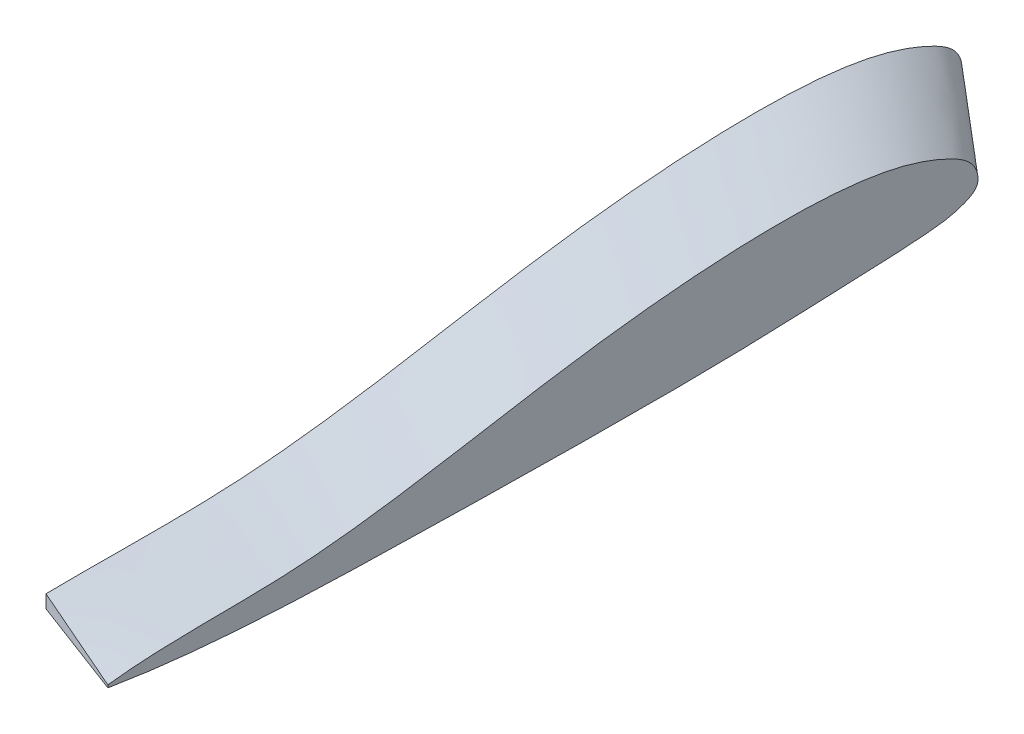
ISO-10303-21;
HEADER;
FILE_DESCRIPTION(('STEP AP214'),'2;1');
FILE_NAME('part.step','',(''),(''),'','','');
FILE_SCHEMA(('AUTOMOTIVE_DESIGN { 1 0 10303 214 1 1 1 1 }'));
ENDSEC;
DATA;
#1=APPLICATION_CONTEXT('core data for automotive mechanical design processes');
#2=APPLICATION_PROTOCOL_DEFINITION('international standard','automotive_design',2000,#1);
#3=PRODUCT_CONTEXT('',#1,'mechanical');
#4=PRODUCT('Part','Part','',(#3));
#5=PRODUCT_RELATED_PRODUCT_CATEGORY('part','',(#4));
#6=PRODUCT_DEFINITION_FORMATION('','',#4);
#7=PRODUCT_DEFINITION_CONTEXT('part definition',#1,'design');
#8=PRODUCT_DEFINITION('design','',#6,#7);
#9=PRODUCT_DEFINITION_SHAPE('','',#8);
#10=(LENGTH_UNIT() NAMED_UNIT(*) SI_UNIT(.MILLI.,.METRE.));
#11=(NAMED_UNIT(*) PLANE_ANGLE_UNIT() SI_UNIT($,.RADIAN.));
#12=(NAMED_UNIT(*) SI_UNIT($,.STERADIAN.) SOLID_ANGLE_UNIT());
#13=UNCERTAINTY_MEASURE_WITH_UNIT(LENGTH_MEASURE(1.E-05),#10,'distance_accuracy_value','');
#14=(GEOMETRIC_REPRESENTATION_CONTEXT(3) GLOBAL_UNCERTAINTY_ASSIGNED_CONTEXT((#13)) GLOBAL_UNIT_ASSIGNED_CONTEXT((#10,
#11,#12)) REPRESENTATION_CONTEXT('',''));
#15=CARTESIAN_POINT('',(0.,0.,0.));
#16=DIRECTION('',(0.,0.,1.));
#17=DIRECTION('',(1.,0.,0.));
#18=AXIS2_PLACEMENT_3D('',#15,#16,#17);
#19=CARTESIAN_POINT('',(170.,4.22486309630593,-316.029681338377));
#20=DIRECTION('',(1.,0.,0.));
#21=DIRECTION('',(0.,0.,-1.));
#22=AXIS2_PLACEMENT_3D('',#19,#20,#21);
#23=PLANE('',#22);
#24=DIRECTION('',(0.,-1.,0.));
#25=VECTOR('',#24,1.);
#26=CARTESIAN_POINT('',(170.,0.,16.3361038268365));
#27=LINE('',#26,#25);
#28=CARTESIAN_POINT('',(170.,0.,16.3361038268365));
#29=VERTEX_POINT('',#28);
#30=CARTESIAN_POINT('',(170.,-0.499999999999999,16.3361038268365));
#31=VERTEX_POINT('',#30);
#32=EDGE_CURVE('E177',#29,#31,#27,.T.);
#33=ORIENTED_EDGE('',*,*,#32,.T.);
#34=CARTESIAN_POINT('',(170.,-0.499999999999999,16.3361038268365));
#35=CARTESIAN_POINT('',(170.,-6.84562442936849,-21.8114676113761));
#36=CARTESIAN_POINT('',(170.,-8.68216132160674,-89.764065602392));
#37=CARTESIAN_POINT('',(170.,-10.1357344512242,-169.980320971194));
#38=CARTESIAN_POINT('',(170.,-9.90480118321219,-225.808636095163));
#39=CARTESIAN_POINT('',(170.,-8.2642986136554,-262.759582746442));
#40=CARTESIAN_POINT('',(170.,-7.22314333972637,-292.426285695098));
#41=CARTESIAN_POINT('',(170.,-5.26921371164876,-308.921424505229));
#42=CARTESIAN_POINT('',(170.,-1.05150908344166,-316.761099289889));
#43=CARTESIAN_POINT('',(170.,8.13638953658617,-316.064783193113));
#44=CARTESIAN_POINT('',(170.,17.9007463393962,-299.115019916297));
#45=CARTESIAN_POINT('',(170.,24.3524605176547,-272.102133361616));
#46=CARTESIAN_POINT('',(170.,25.9306596259218,-217.975981001916));
#47=CARTESIAN_POINT('',(170.,19.2473181685789,-163.129549014309));
#48=CARTESIAN_POINT('',(170.,8.46868752320201,-102.923022989016));
#49=CARTESIAN_POINT('',(170.,0.75449292878266,-48.6946557715225));
#50=CARTESIAN_POINT('',(170.,3.34373370943451,-6.76821708426023));
#51=CARTESIAN_POINT('',(170.,0.5,16.3361038268365));
#52=B_SPLINE_CURVE_WITH_KNOTS('',3,(#34,#35,#36,#37,#38,#39,#40,#41,#42,#43,#44,#45,#46,#47,#48,
#49,#50,#51),.UNSPECIFIED.,.F.,.F.,(4,1,1,1,1,1,1,1,1,1,1,1,1,1,1,4),(0.,0.170754034375658,
0.300594015973302,0.355532481277325,0.417679052325849,0.465123715916775,0.485110270012388,
0.493755431545612,0.499302038772995,0.52179404874064,0.57017493856222,0.626298387408252,
0.758208846476329,0.815081544629808,0.897203908804068,1.),.UNSPECIFIED.);
#53=CARTESIAN_POINT('',(170.,0.5,16.3361038268365));
#54=VERTEX_POINT('',#53);
#55=EDGE_CURVE('E51',#31,#54,#52,.T.);
#56=ORIENTED_EDGE('',*,*,#55,.T.);
#57=DIRECTION('',(0.,-1.,0.));
#58=VECTOR('',#57,1.);
#59=CARTESIAN_POINT('',(170.,0.5,16.3361038268365));
#60=LINE('',#59,#58);
#61=EDGE_CURVE('E11',#54,#29,#60,.T.);
#62=ORIENTED_EDGE('',*,*,#61,.T.);
#63=EDGE_LOOP('',(#33,#56,#62));
#64=FACE_BOUND('',#63,.T.);
#65=ADVANCED_FACE('F41',(#64),#23,.T.);
#66=CARTESIAN_POINT('',(130.,4.50921821265985,-349.839069787723));
#67=DIRECTION('',(1.,0.,0.));
#68=DIRECTION('',(0.,0.,-1.));
#69=AXIS2_PLACEMENT_3D('',#66,#67,#68);
#70=PLANE('',#69);
#71=DIRECTION('',(0.,-1.,0.));
#72=VECTOR('',#71,1.);
#73=CARTESIAN_POINT('',(130.,0.,0.));
#74=LINE('',#73,#72);
#75=CARTESIAN_POINT('',(130.,0.,0.));
#76=VERTEX_POINT('',#75);
#77=CARTESIAN_POINT('',(130.,-2.5,0.));
#78=VERTEX_POINT('',#77);
#79=EDGE_CURVE('E84',#76,#78,#74,.T.);
#80=ORIENTED_EDGE('',*,*,#79,.F.);
#81=DIRECTION('',(0.,-1.,0.));
#82=VECTOR('',#81,1.);
#83=CARTESIAN_POINT('',(130.,0.,0.));
#84=LINE('',#83,#82);
#85=CARTESIAN_POINT('',(130.,2.5,0.));
#86=VERTEX_POINT('',#85);
#87=EDGE_CURVE('E79',#86,#76,#84,.T.);
#88=ORIENTED_EDGE('',*,*,#87,.F.);
#89=CARTESIAN_POINT('',(130.,-2.5,0.));
#90=CARTESIAN_POINT('',(130.,-6.52683155487076,-40.3436066692087));
#91=CARTESIAN_POINT('',(130.,-9.38733182249202,-111.722835657678));
#92=CARTESIAN_POINT('',(130.,-10.6469838114329,-196.124650234008));
#93=CARTESIAN_POINT('',(130.,-10.4304964788481,-254.888785279017));
#94=CARTESIAN_POINT('',(130.,-8.69831278964423,-293.785022846869));
#95=CARTESIAN_POINT('',(130.,-7.60339821007806,-325.013033186047));
#96=CARTESIAN_POINT('',(130.,-5.54653455345342,-342.376346163001));
#97=CARTESIAN_POINT('',(130.,-1.10685261086616,-350.628634815587));
#98=CARTESIAN_POINT('',(130.,8.56462304257141,-349.89567054793));
#99=CARTESIAN_POINT('',(130.,18.8428380093671,-332.053815956821));
#100=CARTESIAN_POINT('',(130.,25.6346311989739,-303.619183469784));
#101=CARTESIAN_POINT('',(130.,27.292304907744,-246.64439175931));
#102=CARTESIAN_POINT('',(130.,20.2823791611908,-188.910565094306));
#103=CARTESIAN_POINT('',(130.,8.87683626299398,-125.537028123098));
#104=CARTESIAN_POINT('',(130.,1.03871569544147,-68.4655600583932));
#105=CARTESIAN_POINT('',(130.,2.86846913775832,-24.378325415327));
#106=CARTESIAN_POINT('',(130.,2.5,0.));
#107=B_SPLINE_CURVE_WITH_KNOTS('',3,(#89,#90,#91,#92,#93,#94,#95,#96,#97,#98,#99,#100,#101,#102,
#103,#104,#105,#106),.UNSPECIFIED.,.F.,.F.,(4,1,1,1,1,1,1,1,1,1,1,1,1,1,1,4),(0.,
0.170552152015115,0.300436508835382,0.355393750379191,0.417561561171372,0.465022439856317,
0.485015824727601,0.493663940905173,0.499212443788481,0.521712140817826,0.570109565706109,
0.626252195782039,0.758207737696827,0.815099873150054,0.897250304165881,1.),.UNSPECIFIED.);
#108=EDGE_CURVE('E89',#78,#86,#107,.T.);
#109=ORIENTED_EDGE('',*,*,#108,.F.);
#110=EDGE_LOOP('',(#80,#88,#109));
#111=FACE_BOUND('',#110,.T.);
#112=ADVANCED_FACE('F93',(#111),#70,.F.);
#113=CARTESIAN_POINT('',(130.,2.5,0.));
#114=DIRECTION('',(-0.378086913544499,0.,0.925770104186992));
#115=DIRECTION('',(0.,-1.,0.));
#116=AXIS2_PLACEMENT_3D('',#113,#114,#115);
#117=PLANE('',#116);
#118=ORIENTED_EDGE('',*,*,#87,.T.);
#119=ORIENTED_EDGE('',*,*,#79,.T.);
#120=DIRECTION('',(0.924779905706245,0.0462389952853123,0.377682513914733));
#121=VECTOR('',#120,1.);
#122=CARTESIAN_POINT('',(150.,-1.5,8.16805191341826));
#123=LINE('',#122,#121);
#124=EDGE_CURVE('E185',#78,#31,#123,.T.);
#125=ORIENTED_EDGE('',*,*,#124,.T.);
#126=ORIENTED_EDGE('',*,*,#32,.F.);
#127=ORIENTED_EDGE('',*,*,#61,.F.);
#128=DIRECTION('',(-0.924779905706245,0.0462389952853123,-0.377682513914733));
#129=VECTOR('',#128,1.);
#130=CARTESIAN_POINT('',(150.,1.5,8.16805191341826));
#131=LINE('',#130,#129);
#132=EDGE_CURVE('E66',#54,#86,#131,.T.);
#133=ORIENTED_EDGE('',*,*,#132,.T.);
#134=EDGE_LOOP('',(#118,#119,#125,#126,#127,#133));
#135=FACE_BOUND('',#134,.T.);
#136=ADVANCED_FACE('F82',(#135),#117,.T.);
#137=CARTESIAN_POINT('',(130.,-2.5,0.));
#138=CARTESIAN_POINT('',(170.,-0.499999999999999,16.3361038268365));
#139=CARTESIAN_POINT('',(130.,-3.23782995173558,-7.3920949898131));
#140=CARTESIAN_POINT('',(170.,-1.66132403045602,9.35464882459921));
#141=CARTESIAN_POINT('',(130.,-4.55214325325728,-22.1881983169651));
#142=CARTESIAN_POINT('',(170.,-3.62878609758597,-4.63864996244742));
#143=CARTESIAN_POINT('',(130.,-5.84776624651561,-40.7072191479516));
#144=CARTESIAN_POINT('',(170.,-5.35663919651856,-22.1909036605759));
#145=CARTESIAN_POINT('',(130.,-6.70958335583673,-55.5334845294046));
#146=CARTESIAN_POINT('',(170.,-6.39394165791507,-36.2600819724738));
#147=CARTESIAN_POINT('',(130.,-7.27700975443384,-66.6577362272056));
#148=CARTESIAN_POINT('',(170.,-7.02290453708791,-46.8233365891352));
#149=CARTESIAN_POINT('',(130.,-7.77393613678356,-77.7857817927111));
#150=CARTESIAN_POINT('',(170.,-7.52632949138648,-57.3956452945747));
#151=CARTESIAN_POINT('',(130.,-8.2087478237841,-88.9167009587384));
#152=CARTESIAN_POINT('',(170.,-7.92766184435001,-67.9748237954257));
#153=CARTESIAN_POINT('',(130.,-8.58991694049283,-100.049666839603));
#154=CARTESIAN_POINT('',(170.,-8.25048173417814,-78.5585020196621));
#155=CARTESIAN_POINT('',(130.,-8.92575625081193,-111.183800939766));
#156=CARTESIAN_POINT('',(170.,-8.51801131241588,-89.1444692517179));
#157=CARTESIAN_POINT('',(130.,-9.22489129858251,-122.318251563554));
#158=CARTESIAN_POINT('',(170.,-8.7542948183318,-99.7303811957156));
#159=CARTESIAN_POINT('',(130.,-9.49517461785586,-133.4521818922));
#160=CARTESIAN_POINT('',(170.,-8.98127724697221,-110.31409352556));
#161=CARTESIAN_POINT('',(130.,-9.73540650643635,-144.586216455451));
#162=CARTESIAN_POINT('',(170.,-9.19427502312363,-120.896507157123));
#163=CARTESIAN_POINT('',(130.,-9.94510589397999,-155.720582903247));
#164=CARTESIAN_POINT('',(170.,-9.39008816916046,-131.478142568964));
#165=CARTESIAN_POINT('',(130.,-10.123400606348,-166.856115595535));
#166=CARTESIAN_POINT('',(170.,-9.56487733433263,-142.059995974318));
#167=CARTESIAN_POINT('',(130.,-10.2697582042739,-177.992569401151));
#168=CARTESIAN_POINT('',(170.,-9.71522038923434,-152.642236699824));
#169=CARTESIAN_POINT('',(130.,-10.3832050922364,-189.131686856909));
#170=CARTESIAN_POINT('',(170.,-9.83728718952534,-163.226631363063));
#171=CARTESIAN_POINT('',(130.,-10.4635008764831,-200.271526659121));
#172=CARTESIAN_POINT('',(170.,-9.9278314819624,-173.811832789014));
#173=CARTESIAN_POINT('',(130.,-10.5090190811312,-211.416904455324));
#174=CARTESIAN_POINT('',(170.,-9.98255869626754,-184.402353502078));
#175=CARTESIAN_POINT('',(130.,-10.5192097033308,-220.703584341392));
#176=CARTESIAN_POINT('',(170.,-9.99667045406446,-193.227472462945));
#177=CARTESIAN_POINT('',(130.,-10.5013327842794,-228.136293729765));
#178=CARTESIAN_POINT('',(170.,-9.98078903447394,-200.290774935022));
#179=CARTESIAN_POINT('',(130.,-10.4710695052254,-233.707077491812));
#180=CARTESIAN_POINT('',(170.,-9.95208238766132,-205.584975884035));
#181=CARTESIAN_POINT('',(130.,-10.4215257190631,-239.277395920448));
#182=CARTESIAN_POINT('',(170.,-9.90444515885829,-210.878614529683));
#183=CARTESIAN_POINT('',(130.,-10.3491421633671,-244.843804196284));
#184=CARTESIAN_POINT('',(170.,-9.83488488731868,-216.168753751006));
#185=CARTESIAN_POINT('',(130.,-10.2514799218834,-250.407170124324));
#186=CARTESIAN_POINT('',(170.,-9.74127169281702,-221.455929910733));
#187=CARTESIAN_POINT('',(130.,-10.1244306290916,-255.965434450514));
#188=CARTESIAN_POINT('',(170.,-9.62010845654546,-226.738266739447));
#189=CARTESIAN_POINT('',(130.,-9.96893219345929,-261.519940271852));
#190=CARTESIAN_POINT('',(170.,-9.47221396059913,-232.016940876178));
#191=CARTESIAN_POINT('',(130.,-9.79060574313636,-267.073387055325));
#192=CARTESIAN_POINT('',(170.,-9.30284768549917,-237.294533015438));
#193=CARTESIAN_POINT('',(130.,-9.593620496424,-272.628318401818));
#194=CARTESIAN_POINT('',(170.,-9.1159213696762,-242.573482839632));
#195=CARTESIAN_POINT('',(130.,-9.38303041789216,-278.187192031005));
#196=CARTESIAN_POINT('',(170.,-8.91615992553049,-247.85610698489));
#197=CARTESIAN_POINT('',(130.,-9.16302255301895,-283.752751860865));
#198=CARTESIAN_POINT('',(170.,-8.70748863470929,-253.145067224281));
#199=CARTESIAN_POINT('',(130.,-8.939022692108,-289.327155930879));
#200=CARTESIAN_POINT('',(170.,-8.49498254395452,-258.442339011495));
#201=CARTESIAN_POINT('',(130.,-8.71428844123652,-294.91364471792));
#202=CARTESIAN_POINT('',(170.,-8.28169940846931,-263.75116452635));
#203=CARTESIAN_POINT('',(130.,-8.49651502716474,-300.513777870296));
#204=CARTESIAN_POINT('',(170.,-8.07482364700018,-269.072745819398));
#205=CARTESIAN_POINT('',(130.,-8.27764407615358,-306.126793076186));
#206=CARTESIAN_POINT('',(170.,-7.86711449909356,-274.407081684827));
#207=CARTESIAN_POINT('',(130.,-8.0775818884476,-310.792245604934));
#208=CARTESIAN_POINT('',(170.,-7.67725972297585,-278.841059935858));
#209=CARTESIAN_POINT('',(130.,-7.89830524102971,-314.52156013128));
#210=CARTESIAN_POINT('',(170.,-7.50736364422403,-282.385135180565));
#211=CARTESIAN_POINT('',(130.,-7.75211502214214,-317.310614591063));
#212=CARTESIAN_POINT('',(170.,-7.36877817079927,-285.032862394691));
#213=CARTESIAN_POINT('',(130.,-7.5920727852328,-320.085329929221));
#214=CARTESIAN_POINT('',(170.,-7.2168753117256,-287.674901126538));
#215=CARTESIAN_POINT('',(130.,-7.41554706432902,-322.856759427775));
#216=CARTESIAN_POINT('',(170.,-7.0496567235396,-290.305893978274));
#217=CARTESIAN_POINT('',(130.,-7.22065736577427,-325.611927097328));
#218=CARTESIAN_POINT('',(170.,-6.86481271042817,-292.926256289661));
#219=CARTESIAN_POINT('',(130.,-7.00514661847085,-328.35572605365));
#220=CARTESIAN_POINT('',(170.,-6.66062316529573,-295.533116120687));
#221=CARTESIAN_POINT('',(130.,-6.76642045225001,-331.082714881711));
#222=CARTESIAN_POINT('',(170.,-6.43414863732604,-298.125672608804));
#223=CARTESIAN_POINT('',(130.,-6.50368958567082,-333.793028282326));
#224=CARTESIAN_POINT('',(170.,-6.18558681803698,-300.701314321524));
#225=CARTESIAN_POINT('',(130.,-6.15976811899438,-336.496452265348));
#226=CARTESIAN_POINT('',(170.,-5.86144875333289,-303.270763761719));
#227=CARTESIAN_POINT('',(130.,-5.75522058538448,-338.754185127669));
#228=CARTESIAN_POINT('',(170.,-5.48041984757455,-305.415821152335));
#229=CARTESIAN_POINT('',(130.,-5.33171257773763,-340.568906790164));
#230=CARTESIAN_POINT('',(170.,-5.08126242975206,-307.140279405038));
#231=CARTESIAN_POINT('',(130.,-4.95621310383961,-341.934973661837));
#232=CARTESIAN_POINT('',(170.,-4.72738444734862,-308.438139045272));
#233=CARTESIAN_POINT('',(130.,-4.51645231893007,-343.310219846895));
#234=CARTESIAN_POINT('',(170.,-4.31247382381592,-309.744648095506));
#235=CARTESIAN_POINT('',(130.,-4.00315910413111,-344.689736373065));
#236=CARTESIAN_POINT('',(170.,-3.82850158289116,-311.055370346781));
#237=CARTESIAN_POINT('',(130.,-3.41266196516121,-346.089310946762));
#238=CARTESIAN_POINT('',(170.,-3.27065367947622,-312.384562954543));
#239=CARTESIAN_POINT('',(130.,-2.72067502893483,-347.439275103883));
#240=CARTESIAN_POINT('',(170.,-2.61927050276892,-313.673145607907));
#241=CARTESIAN_POINT('',(130.,-1.8960600681333,-348.634613392683));
#242=CARTESIAN_POINT('',(170.,-1.84079875466025,-314.816468241333));
#243=CARTESIAN_POINT('',(130.,-1.07308002117814,-349.422697671014));
#244=CARTESIAN_POINT('',(170.,-1.06748449033377,-315.579206812093));
#245=CARTESIAN_POINT('',(130.,-0.318763478477674,-349.880349694728));
#246=CARTESIAN_POINT('',(170.,-0.354332451161625,-316.02198159056));
#247=CARTESIAN_POINT('',(130.,0.506454589304773,-350.202209237996));
#248=CARTESIAN_POINT('',(170.,0.422083697393705,-316.34321619078));
#249=CARTESIAN_POINT('',(130.,1.65800841231567,-350.353338548107));
#250=CARTESIAN_POINT('',(170.,1.51171850863613,-316.498253870303));
#251=CARTESIAN_POINT('',(130.,3.1166810218346,-350.219893045163));
#252=CARTESIAN_POINT('',(170.,2.89700656562899,-316.384044775689));
#253=CARTESIAN_POINT('',(130.,4.52719603357444,-349.8664630454));
#254=CARTESIAN_POINT('',(170.,4.24165296934703,-316.056329453827));
#255=CARTESIAN_POINT('',(130.,5.82955367397417,-349.348454168648));
#256=CARTESIAN_POINT('',(170.,5.48400466819295,-315.57010965636));
#257=CARTESIAN_POINT('',(130.,7.42895119837764,-348.461140138572));
#258=CARTESIAN_POINT('',(170.,7.00938330245895,-314.735883985991));
#259=CARTESIAN_POINT('',(130.,9.22763777759756,-346.992881277034));
#260=CARTESIAN_POINT('',(170.,8.72422378152515,-313.34863773876));
#261=CARTESIAN_POINT('',(130.,11.0643634651151,-344.822535399649));
#262=CARTESIAN_POINT('',(170.,10.4755877192802,-311.294350767885));
#263=CARTESIAN_POINT('',(130.,12.6685878031202,-342.339345635965));
#264=CARTESIAN_POINT('',(170.,12.0045365276345,-308.938975129196));
#265=CARTESIAN_POINT('',(130.,14.0740995614028,-339.680876961185));
#266=CARTESIAN_POINT('',(170.,13.3436617347116,-306.4153335703));
#267=CARTESIAN_POINT('',(130.,15.3519665018517,-336.969753061275));
#268=CARTESIAN_POINT('',(170.,14.5600250328548,-303.838383487856));
#269=CARTESIAN_POINT('',(130.,16.5299583025164,-334.287186265776));
#270=CARTESIAN_POINT('',(170.,15.6814936021382,-301.289013922207));
#271=CARTESIAN_POINT('',(130.,17.6105767924751,-331.603453321359));
#272=CARTESIAN_POINT('',(170.,16.7102477632593,-298.73825982992));
#273=CARTESIAN_POINT('',(130.,18.5981480456581,-328.935593958981));
#274=CARTESIAN_POINT('',(170.,17.6503680852827,-296.203131538187));
#275=CARTESIAN_POINT('',(130.,19.8024916080653,-325.370425165219));
#276=CARTESIAN_POINT('',(170.,18.7971688269912,-292.814233310431));
#277=CARTESIAN_POINT('',(130.,21.098139213827,-320.940945390688));
#278=CARTESIAN_POINT('',(170.,20.0304801879113,-288.605714205471));
#279=CARTESIAN_POINT('',(130.,22.3725698221172,-315.599175350127));
#280=CARTESIAN_POINT('',(170.,21.2440666847524,-283.528833508052));
#281=CARTESIAN_POINT('',(130.,23.400187830813,-310.242831668448));
#282=CARTESIAN_POINT('',(170.,22.22248193174,-278.439166645473));
#283=CARTESIAN_POINT('',(130.,24.2262862067134,-304.838113420169));
#284=CARTESIAN_POINT('',(170.,23.0091059061911,-273.303207543377));
#285=CARTESIAN_POINT('',(130.,24.8897306616486,-299.376383446311));
#286=CARTESIAN_POINT('',(170.,23.6409039044302,-268.113319082669));
#287=CARTESIAN_POINT('',(130.,25.4039619317586,-293.863362181867));
#288=CARTESIAN_POINT('',(170.,24.1308418329049,-262.874432937944));
#289=CARTESIAN_POINT('',(130.,25.7816866252475,-288.311016773237));
#290=CARTESIAN_POINT('',(170.,24.4908669494203,-257.598178998768));
#291=CARTESIAN_POINT('',(130.,26.0360713443454,-282.727923523733));
#292=CARTESIAN_POINT('',(170.,24.7335131678096,-252.29257961023));
#293=CARTESIAN_POINT('',(130.,26.1799697320526,-277.124420032471));
#294=CARTESIAN_POINT('',(170.,24.8709294527377,-246.96754697139));
#295=CARTESIAN_POINT('',(130.,26.2265620085316,-271.510060872059));
#296=CARTESIAN_POINT('',(170.,24.9156425232329,-241.632115820156));
#297=CARTESIAN_POINT('',(130.,26.1884741063975,-265.894419219548));
#298=CARTESIAN_POINT('',(170.,24.8795898825232,-236.295416608688));
#299=CARTESIAN_POINT('',(130.,26.0796074617513,-260.28811599983));
#300=CARTESIAN_POINT('',(170.,24.7759813178487,-230.967561109384));
#301=CARTESIAN_POINT('',(130.,25.9038475338326,-254.691885724245));
#302=CARTESIAN_POINT('',(170.,24.6085958539959,-225.649293826762));
#303=CARTESIAN_POINT('',(130.,25.6633165874525,-249.105310277291));
#304=CARTESIAN_POINT('',(170.,24.3794904517601,-220.34022344731));
#305=CARTESIAN_POINT('',(130.,25.3607147209072,-243.527305911384));
#306=CARTESIAN_POINT('',(170.,24.0912836179208,-215.03927056424));
#307=CARTESIAN_POINT('',(130.,24.9986726004277,-237.959104352157));
#308=CARTESIAN_POINT('',(170.,23.7465278776668,-209.747709789388));
#309=CARTESIAN_POINT('',(130.,24.439712227265,-230.543200098577));
#310=CARTESIAN_POINT('',(170.,23.2143744842085,-202.700077733814));
#311=CARTESIAN_POINT('',(130.,23.6054912247898,-221.297432565166));
#312=CARTESIAN_POINT('',(170.,22.4204984370734,-193.913733909887));
#313=CARTESIAN_POINT('',(130.,22.406679218765,-210.226900849994));
#314=CARTESIAN_POINT('',(170.,21.2804562990792,-183.393037229746));
#315=CARTESIAN_POINT('',(130.,21.0317219807429,-199.18375236853));
#316=CARTESIAN_POINT('',(170.,19.9739461913078,-172.898485730889));
#317=CARTESIAN_POINT('',(130.,19.4998421207062,-188.161598652189));
#318=CARTESIAN_POINT('',(170.,18.5196862746816,-162.423779327803));
#319=CARTESIAN_POINT('',(130.,17.8334269070409,-177.158720568216));
#320=CARTESIAN_POINT('',(170.,16.9392185760249,-151.967384822058));
#321=CARTESIAN_POINT('',(130.,16.0489909193691,-166.171672691021));
#322=CARTESIAN_POINT('',(170.,15.2489756630355,-141.525962782551));
#323=CARTESIAN_POINT('',(130.,14.1831845633178,-155.194809238466));
#324=CARTESIAN_POINT('',(170.,13.4823860630558,-131.094158515051));
#325=CARTESIAN_POINT('',(130.,12.2983117721465,-144.216319362982));
#326=CARTESIAN_POINT('',(170.,11.6929924272159,-120.66100702464));
#327=CARTESIAN_POINT('',(130.,10.4482407352043,-133.227275182572));
#328=CARTESIAN_POINT('',(170.,9.92849560395179,-110.217998015065));
#329=CARTESIAN_POINT('',(130.,8.69133946173831,-122.215981653727));
#330=CARTESIAN_POINT('',(170.,8.23897566898748,-99.7542751354826));
#331=CARTESIAN_POINT('',(130.,7.07437028513674,-111.182207541085));
#332=CARTESIAN_POINT('',(170.,6.67681704493591,-89.2693065540079));
#333=CARTESIAN_POINT('',(130.,5.63905587943154,-100.126727853648));
#334=CARTESIAN_POINT('',(170.,5.29584159127195,-78.7635086714269));
#335=CARTESIAN_POINT('',(130.,4.63500114855755,-90.8966096636769));
#336=CARTESIAN_POINT('',(170.,4.34023976594536,-69.9919021741619));
#337=CARTESIAN_POINT('',(130.,3.96509082417608,-83.5023415816821));
#338=CARTESIAN_POINT('',(170.,3.71982879862307,-62.9644254506624));
#339=CARTESIAN_POINT('',(130.,3.53701396053521,-77.9516851776582));
#340=CARTESIAN_POINT('',(170.,3.33279413686269,-57.6890102715023));
#341=CARTESIAN_POINT('',(130.,3.19098212602596,-72.3962048535878));
#342=CARTESIAN_POINT('',(170.,3.03191145572081,-52.4085902763717));
#343=CARTESIAN_POINT('',(130.,2.83416511022951,-64.9828884411191));
#344=CARTESIAN_POINT('',(170.,2.74986409802982,-45.3617598388875));
#345=CARTESIAN_POINT('',(130.,2.57512663096449,-55.7057677992436));
#346=CARTESIAN_POINT('',(170.,2.57132812005809,-36.5436337129171));
#347=CARTESIAN_POINT('',(130.,2.46821582103482,-44.5633548662816));
#348=CARTESIAN_POINT('',(170.,2.49128049174082,-25.9539372841696));
#349=CARTESIAN_POINT('',(130.,2.49262412487495,-33.4155469489854));
#350=CARTESIAN_POINT('',(170.,2.39943518499234,-15.363395769691));
#351=CARTESIAN_POINT('',(130.,2.56380747274579,-22.268457101337));
#352=CARTESIAN_POINT('',(170.,2.15049362091625,-4.77928899497996));
#353=CARTESIAN_POINT('',(130.,2.60412591973672,-11.1271194476215));
#354=CARTESIAN_POINT('',(170.,1.59882569153213,5.79117547393965));
#355=CARTESIAN_POINT('',(130.,2.55603257733014,-3.70717724779871));
#356=CARTESIAN_POINT('',(170.,0.932247361674707,12.8242483658365));
#357=CARTESIAN_POINT('',(130.,2.5,0.));
#358=CARTESIAN_POINT('',(170.,0.5,16.3361038268365));
#359=B_SPLINE_SURFACE_WITH_KNOTS('',3,1,((#137,#138),(#139,#140),(#141,#142),(#143,#144),(#145,
#146),(#147,#148),(#149,#150),(#151,#152),(#153,#154),(#155,#156),(#157,#158),(#159,#160),(#161,
#162),(#163,#164),(#165,#166),(#167,#168),(#169,#170),(#171,#172),(#173,#174),(#175,#176),(#177,
#178),(#179,#180),(#181,#182),(#183,#184),(#185,#186),(#187,#188),(#189,#190),(#191,#192),(#193,
#194),(#195,#196),(#197,#198),(#199,#200),(#201,#202),(#203,#204),(#205,#206),(#207,#208),(#209,
#210),(#211,#212),(#213,#214),(#215,#216),(#217,#218),(#219,#220),(#221,#222),(#223,#224),(#225,
#226),(#227,#228),(#229,#230),(#231,#232),(#233,#234),(#235,#236),(#237,#238),(#239,#240),(#241,
#242),(#243,#244),(#245,#246),(#247,#248),(#249,#250),(#251,#252),(#253,#254),(#255,#256),(#257,
#258),(#259,#260),(#261,#262),(#263,#264),(#265,#266),(#267,#268),(#269,#270),(#271,#272),(#273,
#274),(#275,#276),(#277,#278),(#279,#280),(#281,#282),(#283,#284),(#285,#286),(#287,#288),(#289,
#290),(#291,#292),(#293,#294),(#295,#296),(#297,#298),(#299,#300),(#301,#302),(#303,#304),(#305,
#306),(#307,#308),(#309,#310),(#311,#312),(#313,#314),(#315,#316),(#317,#318),(#319,#320),(#321,
#322),(#323,#324),(#325,#326),(#327,#328),(#329,#330),(#331,#332),(#333,#334),(#335,#336),(#337,
#338),(#339,#340),(#341,#342),(#343,#344),(#345,#346),(#347,#348),(#349,#350),(#351,#352),(#353,
#354),(#355,#356),(#357,#358)),.UNSPECIFIED.,.F.,.F.,.F.,(4,1,1,1,1,1,1,1,1,1,1,1,1,1,1,1,1,1,1,
1,1,1,1,1,1,1,1,1,1,1,1,1,1,1,1,1,1,1,1,1,1,1,1,1,1,1,1,1,1,1,1,1,1,1,1,1,1,1,1,1,1,1,1,1,1,1,1,
1,1,1,1,1,1,1,1,1,1,1,1,1,1,1,1,1,1,1,1,1,1,1,1,1,1,1,1,1,1,1,1,1,1,1,1,1,1,1,1,1,4),(2,2),(0.,
0.03125,0.0625,0.078125,0.09375,0.109375,0.125,0.140625,0.15625,0.171875,0.1875,0.203125,
0.21875,0.234375,0.25,0.265625,0.28125,0.296875,0.3125,0.3203125,0.328125,0.3359375,0.34375,
0.3515625,0.359375,0.3671875,0.375,0.3828125,0.390625,0.3984375,0.40625,0.4140625,0.421875,
0.4296875,0.4375,0.44140625,0.4453125,0.44921875,0.453125,0.45703125,0.4609375,0.46484375,
0.46875,0.47265625,0.4765625,0.478515625,0.48046875,0.482421875,0.484375,0.486328125,0.48828125,
0.490234375,0.4921875,0.4931640625,0.494140625,0.49609375,0.498046875,0.5,0.501953125,
0.50390625,0.5078125,0.51171875,0.515625,0.51953125,0.5234375,0.52734375,0.53125,0.53515625,
0.5390625,0.546875,0.5546875,0.5625,0.5703125,0.578125,0.5859375,0.59375,0.6015625,0.609375,
0.6171875,0.625,0.6328125,0.640625,0.6484375,0.65625,0.6640625,0.671875,0.6875,0.703125,0.71875,
0.734375,0.75,0.765625,0.78125,0.796875,0.8125,0.828125,0.84375,0.859375,0.875,0.8828125,
0.890625,0.8984375,0.90625,0.921875,0.9375,0.953125,0.96875,0.984375,1.),(0.,1.),.UNSPECIFIED.);
#360=ORIENTED_EDGE('',*,*,#108,.T.);
#361=ORIENTED_EDGE('',*,*,#132,.F.);
#362=ORIENTED_EDGE('',*,*,#55,.F.);
#363=ORIENTED_EDGE('',*,*,#124,.F.);
#364=EDGE_LOOP('',(#360,#361,#362,#363));
#365=FACE_BOUND('',#364,.T.);
#366=ADVANCED_FACE('F141',(#365),#359,.T.);
#367=CLOSED_SHELL('',(#65,#112,#136,#366));
#368=MANIFOLD_SOLID_BREP('B2',#367);
#369=ADVANCED_BREP_SHAPE_REPRESENTATION('',(#18,#368),#14);
#370=SHAPE_DEFINITION_REPRESENTATION(#9,#369);
ENDSEC;
END-ISO-10303-21;
